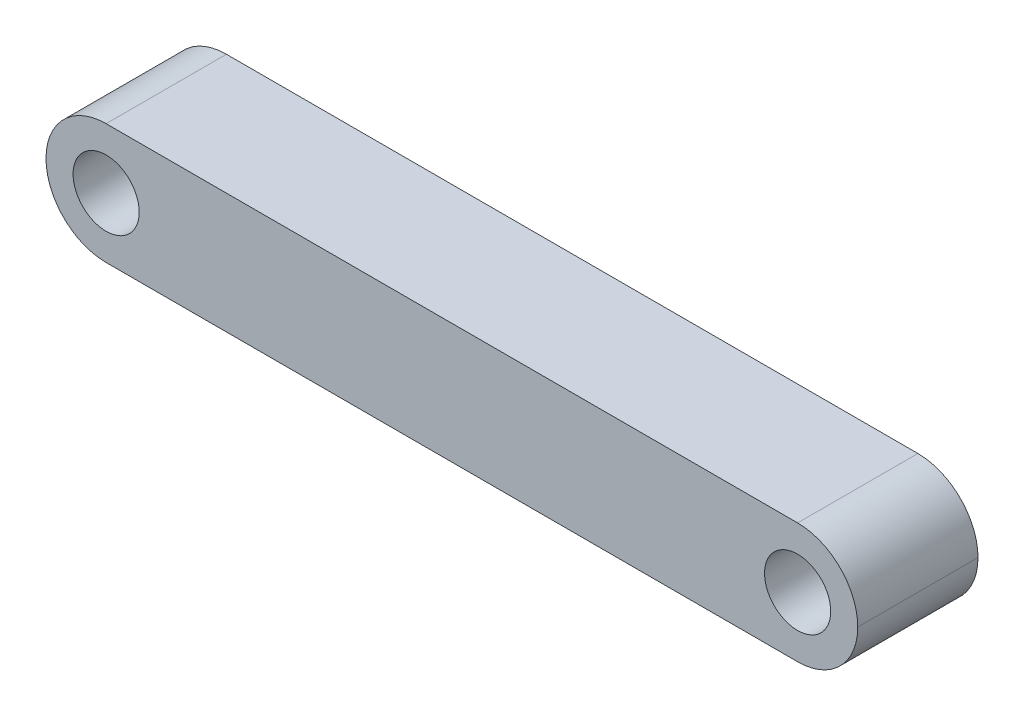
ISO-10303-21;
HEADER;
FILE_DESCRIPTION(('STEP AP214'),'2;1');
FILE_NAME('part.step','',(''),(''),'','','');
FILE_SCHEMA(('AUTOMOTIVE_DESIGN { 1 0 10303 214 1 1 1 1 }'));
ENDSEC;
DATA;
#1=APPLICATION_CONTEXT('core data for automotive mechanical design processes');
#2=APPLICATION_PROTOCOL_DEFINITION('international standard','automotive_design',2000,#1);
#3=PRODUCT_CONTEXT('',#1,'mechanical');
#4=PRODUCT('Part','Part','',(#3));
#5=PRODUCT_RELATED_PRODUCT_CATEGORY('part','',(#4));
#6=PRODUCT_DEFINITION_FORMATION('','',#4);
#7=PRODUCT_DEFINITION_CONTEXT('part definition',#1,'design');
#8=PRODUCT_DEFINITION('design','',#6,#7);
#9=PRODUCT_DEFINITION_SHAPE('','',#8);
#10=(LENGTH_UNIT() NAMED_UNIT(*) SI_UNIT(.MILLI.,.METRE.));
#11=(NAMED_UNIT(*) PLANE_ANGLE_UNIT() SI_UNIT($,.RADIAN.));
#12=(NAMED_UNIT(*) SI_UNIT($,.STERADIAN.) SOLID_ANGLE_UNIT());
#13=UNCERTAINTY_MEASURE_WITH_UNIT(LENGTH_MEASURE(1.E-05),#10,'distance_accuracy_value','');
#14=(GEOMETRIC_REPRESENTATION_CONTEXT(3) GLOBAL_UNCERTAINTY_ASSIGNED_CONTEXT((#13)) GLOBAL_UNIT_ASSIGNED_CONTEXT((#10,
#11,#12)) REPRESENTATION_CONTEXT('',''));
#15=CARTESIAN_POINT('',(0.,0.,0.));
#16=DIRECTION('',(0.,0.,1.));
#17=DIRECTION('',(1.,0.,0.));
#18=AXIS2_PLACEMENT_3D('',#15,#16,#17);
#19=CARTESIAN_POINT('',(-13.5,2.,4.));
#20=DIRECTION('',(0.,-1.,0.));
#21=DIRECTION('',(0.,0.,-1.));
#22=AXIS2_PLACEMENT_3D('',#19,#20,#21);
#23=PLANE('',#22);
#24=DIRECTION('',(-1.,0.,0.));
#25=VECTOR('',#24,1.);
#26=CARTESIAN_POINT('',(-13.5,2.,0.));
#27=LINE('',#26,#25);
#28=CARTESIAN_POINT('',(11.5,2.,0.));
#29=VERTEX_POINT('',#28);
#30=CARTESIAN_POINT('',(-11.5,2.,0.));
#31=VERTEX_POINT('',#30);
#32=EDGE_CURVE('E118',#29,#31,#27,.T.);
#33=ORIENTED_EDGE('',*,*,#32,.T.);
#34=DIRECTION('',(0.,0.,-1.));
#35=VECTOR('',#34,1.);
#36=CARTESIAN_POINT('',(-11.5,2.,4.));
#37=LINE('',#36,#35);
#38=CARTESIAN_POINT('',(-11.5,2.,4.));
#39=VERTEX_POINT('',#38);
#40=EDGE_CURVE('E11',#31,#39,#37,.F.);
#41=ORIENTED_EDGE('',*,*,#40,.T.);
#42=DIRECTION('',(-1.,0.,0.));
#43=VECTOR('',#42,1.);
#44=CARTESIAN_POINT('',(-13.5,2.,4.));
#45=LINE('',#44,#43);
#46=CARTESIAN_POINT('',(11.5,2.,4.));
#47=VERTEX_POINT('',#46);
#48=EDGE_CURVE('E117',#47,#39,#45,.T.);
#49=ORIENTED_EDGE('',*,*,#48,.F.);
#50=DIRECTION('',(0.,0.,-1.));
#51=VECTOR('',#50,1.);
#52=CARTESIAN_POINT('',(11.5,2.,4.));
#53=LINE('',#52,#51);
#54=EDGE_CURVE('E44',#47,#29,#53,.T.);
#55=ORIENTED_EDGE('',*,*,#54,.T.);
#56=EDGE_LOOP('',(#33,#41,#49,#55));
#57=FACE_BOUND('',#56,.T.);
#58=ADVANCED_FACE('F35',(#57),#23,.F.);
#59=CARTESIAN_POINT('',(-13.5,-2.,4.));
#60=DIRECTION('',(0.,1.,0.));
#61=DIRECTION('',(0.,0.,1.));
#62=AXIS2_PLACEMENT_3D('',#59,#60,#61);
#63=PLANE('',#62);
#64=DIRECTION('',(1.,0.,0.));
#65=VECTOR('',#64,1.);
#66=CARTESIAN_POINT('',(-13.5,-2.,4.));
#67=LINE('',#66,#65);
#68=CARTESIAN_POINT('',(-11.5,-2.,4.));
#69=VERTEX_POINT('',#68);
#70=CARTESIAN_POINT('',(11.5,-2.,4.));
#71=VERTEX_POINT('',#70);
#72=EDGE_CURVE('E110',#69,#71,#67,.T.);
#73=ORIENTED_EDGE('',*,*,#72,.F.);
#74=DIRECTION('',(0.,0.,-1.));
#75=VECTOR('',#74,1.);
#76=CARTESIAN_POINT('',(-11.5,-2.,4.));
#77=LINE('',#76,#75);
#78=CARTESIAN_POINT('',(-11.5,-2.,0.));
#79=VERTEX_POINT('',#78);
#80=EDGE_CURVE('E94',#69,#79,#77,.T.);
#81=ORIENTED_EDGE('',*,*,#80,.T.);
#82=DIRECTION('',(1.,0.,0.));
#83=VECTOR('',#82,1.);
#84=CARTESIAN_POINT('',(-13.5,-2.,0.));
#85=LINE('',#84,#83);
#86=CARTESIAN_POINT('',(11.5,-2.,0.));
#87=VERTEX_POINT('',#86);
#88=EDGE_CURVE('E107',#79,#87,#85,.T.);
#89=ORIENTED_EDGE('',*,*,#88,.T.);
#90=DIRECTION('',(0.,0.,-1.));
#91=VECTOR('',#90,1.);
#92=CARTESIAN_POINT('',(11.5,-2.,4.));
#93=LINE('',#92,#91);
#94=EDGE_CURVE('E112',#87,#71,#93,.F.);
#95=ORIENTED_EDGE('',*,*,#94,.T.);
#96=EDGE_LOOP('',(#73,#81,#89,#95));
#97=FACE_BOUND('',#96,.T.);
#98=ADVANCED_FACE('F105',(#97),#63,.F.);
#99=CARTESIAN_POINT('',(0.,0.,4.));
#100=DIRECTION('',(0.,0.,-1.));
#101=DIRECTION('',(-1.,0.,0.));
#102=AXIS2_PLACEMENT_3D('',#99,#100,#101);
#103=PLANE('',#102);
#104=CARTESIAN_POINT('',(-11.5,0.,4.));
#105=DIRECTION('',(0.,0.,1.));
#106=DIRECTION('',(1.,0.,0.));
#107=AXIS2_PLACEMENT_3D('',#104,#105,#106);
#108=CIRCLE('',#107,1.1);
#109=CARTESIAN_POINT('',(-10.4,0.,4.));
#110=VERTEX_POINT('',#109);
#111=EDGE_CURVE('E140',#110,#110,#108,.T.);
#112=ORIENTED_EDGE('',*,*,#111,.F.);
#113=EDGE_LOOP('',(#112));
#114=FACE_BOUND('',#113,.T.);
#115=CARTESIAN_POINT('',(11.5,0.,4.));
#116=DIRECTION('',(0.,0.,1.));
#117=DIRECTION('',(1.,0.,0.));
#118=AXIS2_PLACEMENT_3D('',#115,#116,#117);
#119=CIRCLE('',#118,1.1);
#120=CARTESIAN_POINT('',(12.6,0.,4.));
#121=VERTEX_POINT('',#120);
#122=EDGE_CURVE('E145',#121,#121,#119,.T.);
#123=ORIENTED_EDGE('',*,*,#122,.F.);
#124=EDGE_LOOP('',(#123));
#125=FACE_BOUND('',#124,.T.);
#126=CARTESIAN_POINT('',(-11.5,0.,4.));
#127=DIRECTION('',(0.,0.,-1.));
#128=DIRECTION('',(-1.,0.,0.));
#129=AXIS2_PLACEMENT_3D('',#126,#127,#128);
#130=CIRCLE('',#129,2.);
#131=CARTESIAN_POINT('',(-13.5,0.,4.));
#132=VERTEX_POINT('',#131);
#133=EDGE_CURVE('E52',#39,#132,#130,.F.);
#134=ORIENTED_EDGE('',*,*,#133,.T.);
#135=CARTESIAN_POINT('',(-11.5,0.,4.));
#136=DIRECTION('',(0.,0.,-1.));
#137=DIRECTION('',(-1.,0.,0.));
#138=AXIS2_PLACEMENT_3D('',#135,#136,#137);
#139=CIRCLE('',#138,2.);
#140=EDGE_CURVE('E132',#132,#69,#139,.F.);
#141=ORIENTED_EDGE('',*,*,#140,.T.);
#142=ORIENTED_EDGE('',*,*,#72,.T.);
#143=CARTESIAN_POINT('',(11.5,0.,4.));
#144=DIRECTION('',(0.,0.,-1.));
#145=DIRECTION('',(-1.,0.,0.));
#146=AXIS2_PLACEMENT_3D('',#143,#144,#145);
#147=CIRCLE('',#146,2.);
#148=CARTESIAN_POINT('',(13.5,0.,4.));
#149=VERTEX_POINT('',#148);
#150=EDGE_CURVE('E129',#71,#149,#147,.F.);
#151=ORIENTED_EDGE('',*,*,#150,.T.);
#152=CARTESIAN_POINT('',(11.5,0.,4.));
#153=DIRECTION('',(0.,0.,-1.));
#154=DIRECTION('',(-1.,0.,0.));
#155=AXIS2_PLACEMENT_3D('',#152,#153,#154);
#156=CIRCLE('',#155,2.);
#157=EDGE_CURVE('E99',#149,#47,#156,.F.);
#158=ORIENTED_EDGE('',*,*,#157,.T.);
#159=ORIENTED_EDGE('',*,*,#48,.T.);
#160=EDGE_LOOP('',(#134,#141,#142,#151,#158,#159));
#161=FACE_BOUND('',#160,.T.);
#162=ADVANCED_FACE('F151',(#114,#125,#161),#103,.F.);
#163=CARTESIAN_POINT('',(0.,0.,0.));
#164=DIRECTION('',(0.,0.,-1.));
#165=DIRECTION('',(-1.,0.,0.));
#166=AXIS2_PLACEMENT_3D('',#163,#164,#165);
#167=PLANE('',#166);
#168=CARTESIAN_POINT('',(-11.5,0.,0.));
#169=DIRECTION('',(0.,0.,-1.));
#170=DIRECTION('',(-1.,0.,0.));
#171=AXIS2_PLACEMENT_3D('',#168,#169,#170);
#172=CIRCLE('',#171,1.1);
#173=CARTESIAN_POINT('',(-12.6,0.,0.));
#174=VERTEX_POINT('',#173);
#175=EDGE_CURVE('E39',#174,#174,#172,.T.);
#176=ORIENTED_EDGE('',*,*,#175,.F.);
#177=EDGE_LOOP('',(#176));
#178=FACE_BOUND('',#177,.T.);
#179=CARTESIAN_POINT('',(11.5,0.,0.));
#180=DIRECTION('',(0.,0.,-1.));
#181=DIRECTION('',(-1.,0.,0.));
#182=AXIS2_PLACEMENT_3D('',#179,#180,#181);
#183=CIRCLE('',#182,1.1);
#184=CARTESIAN_POINT('',(10.4,0.,0.));
#185=VERTEX_POINT('',#184);
#186=EDGE_CURVE('E138',#185,#185,#183,.T.);
#187=ORIENTED_EDGE('',*,*,#186,.F.);
#188=EDGE_LOOP('',(#187));
#189=FACE_BOUND('',#188,.T.);
#190=ORIENTED_EDGE('',*,*,#88,.F.);
#191=CARTESIAN_POINT('',(-11.5,0.,0.));
#192=DIRECTION('',(0.,0.,-1.));
#193=DIRECTION('',(-1.,0.,0.));
#194=AXIS2_PLACEMENT_3D('',#191,#192,#193);
#195=CIRCLE('',#194,2.);
#196=CARTESIAN_POINT('',(-13.5,0.,0.));
#197=VERTEX_POINT('',#196);
#198=EDGE_CURVE('E90',#79,#197,#195,.T.);
#199=ORIENTED_EDGE('',*,*,#198,.T.);
#200=CARTESIAN_POINT('',(-11.5,0.,0.));
#201=DIRECTION('',(0.,0.,-1.));
#202=DIRECTION('',(-1.,0.,0.));
#203=AXIS2_PLACEMENT_3D('',#200,#201,#202);
#204=CIRCLE('',#203,2.);
#205=EDGE_CURVE('E100',#197,#31,#204,.T.);
#206=ORIENTED_EDGE('',*,*,#205,.T.);
#207=ORIENTED_EDGE('',*,*,#32,.F.);
#208=CARTESIAN_POINT('',(11.5,0.,0.));
#209=DIRECTION('',(0.,0.,-1.));
#210=DIRECTION('',(-1.,0.,0.));
#211=AXIS2_PLACEMENT_3D('',#208,#209,#210);
#212=CIRCLE('',#211,2.);
#213=CARTESIAN_POINT('',(13.5,0.,0.));
#214=VERTEX_POINT('',#213);
#215=EDGE_CURVE('E111',#29,#214,#212,.T.);
#216=ORIENTED_EDGE('',*,*,#215,.T.);
#217=CARTESIAN_POINT('',(11.5,0.,0.));
#218=DIRECTION('',(0.,0.,-1.));
#219=DIRECTION('',(-1.,0.,0.));
#220=AXIS2_PLACEMENT_3D('',#217,#218,#219);
#221=CIRCLE('',#220,2.);
#222=EDGE_CURVE('E116',#214,#87,#221,.T.);
#223=ORIENTED_EDGE('',*,*,#222,.T.);
#224=EDGE_LOOP('',(#190,#199,#206,#207,#216,#223));
#225=FACE_BOUND('',#224,.T.);
#226=ADVANCED_FACE('F114',(#178,#189,#225),#167,.T.);
#227=CARTESIAN_POINT('',(-11.5,0.,4.));
#228=DIRECTION('',(0.,0.,-1.));
#229=DIRECTION('',(-1.,0.,0.));
#230=AXIS2_PLACEMENT_3D('',#227,#228,#229);
#231=CYLINDRICAL_SURFACE('',#230,2.);
#232=DIRECTION('',(0.,0.,-1.));
#233=VECTOR('',#232,1.);
#234=CARTESIAN_POINT('',(-13.5,0.,4.));
#235=LINE('',#234,#233);
#236=EDGE_CURVE('E95',#132,#197,#235,.T.);
#237=ORIENTED_EDGE('',*,*,#236,.F.);
#238=ORIENTED_EDGE('',*,*,#133,.F.);
#239=ORIENTED_EDGE('',*,*,#40,.F.);
#240=ORIENTED_EDGE('',*,*,#205,.F.);
#241=EDGE_LOOP('',(#237,#238,#239,#240));
#242=FACE_BOUND('',#241,.T.);
#243=ADVANCED_FACE('F177',(#242),#231,.T.);
#244=CARTESIAN_POINT('',(-11.5,0.,4.));
#245=DIRECTION('',(0.,0.,-1.));
#246=DIRECTION('',(-1.,0.,0.));
#247=AXIS2_PLACEMENT_3D('',#244,#245,#246);
#248=CYLINDRICAL_SURFACE('',#247,2.);
#249=ORIENTED_EDGE('',*,*,#140,.F.);
#250=ORIENTED_EDGE('',*,*,#236,.T.);
#251=ORIENTED_EDGE('',*,*,#198,.F.);
#252=ORIENTED_EDGE('',*,*,#80,.F.);
#253=EDGE_LOOP('',(#249,#250,#251,#252));
#254=FACE_BOUND('',#253,.T.);
#255=ADVANCED_FACE('F93',(#254),#248,.T.);
#256=CARTESIAN_POINT('',(11.5,0.,4.));
#257=DIRECTION('',(0.,0.,-1.));
#258=DIRECTION('',(-1.,0.,0.));
#259=AXIS2_PLACEMENT_3D('',#256,#257,#258);
#260=CYLINDRICAL_SURFACE('',#259,2.);
#261=ORIENTED_EDGE('',*,*,#54,.F.);
#262=ORIENTED_EDGE('',*,*,#157,.F.);
#263=DIRECTION('',(0.,0.,-1.));
#264=VECTOR('',#263,1.);
#265=CARTESIAN_POINT('',(13.5,0.,4.));
#266=LINE('',#265,#264);
#267=EDGE_CURVE('E136',#214,#149,#266,.F.);
#268=ORIENTED_EDGE('',*,*,#267,.F.);
#269=ORIENTED_EDGE('',*,*,#215,.F.);
#270=EDGE_LOOP('',(#261,#262,#268,#269));
#271=FACE_BOUND('',#270,.T.);
#272=ADVANCED_FACE('F37',(#271),#260,.T.);
#273=CARTESIAN_POINT('',(11.5,0.,4.));
#274=DIRECTION('',(0.,0.,-1.));
#275=DIRECTION('',(-1.,0.,0.));
#276=AXIS2_PLACEMENT_3D('',#273,#274,#275);
#277=CYLINDRICAL_SURFACE('',#276,2.);
#278=ORIENTED_EDGE('',*,*,#150,.F.);
#279=ORIENTED_EDGE('',*,*,#94,.F.);
#280=ORIENTED_EDGE('',*,*,#222,.F.);
#281=ORIENTED_EDGE('',*,*,#267,.T.);
#282=EDGE_LOOP('',(#278,#279,#280,#281));
#283=FACE_BOUND('',#282,.T.);
#284=ADVANCED_FACE('F158',(#283),#277,.T.);
#285=CARTESIAN_POINT('',(11.5,0.,-9.));
#286=DIRECTION('',(0.,0.,1.));
#287=DIRECTION('',(1.,0.,0.));
#288=AXIS2_PLACEMENT_3D('',#285,#286,#287);
#289=CYLINDRICAL_SURFACE('',#288,1.1);
#290=ORIENTED_EDGE('',*,*,#186,.T.);
#291=EDGE_LOOP('',(#290));
#292=FACE_BOUND('',#291,.T.);
#293=ORIENTED_EDGE('',*,*,#122,.T.);
#294=EDGE_LOOP('',(#293));
#295=FACE_BOUND('',#294,.T.);
#296=ADVANCED_FACE('F160',(#292,#295),#289,.F.);
#297=CARTESIAN_POINT('',(-11.5,0.,-9.));
#298=DIRECTION('',(0.,0.,1.));
#299=DIRECTION('',(1.,0.,0.));
#300=AXIS2_PLACEMENT_3D('',#297,#298,#299);
#301=CYLINDRICAL_SURFACE('',#300,1.1);
#302=ORIENTED_EDGE('',*,*,#175,.T.);
#303=EDGE_LOOP('',(#302));
#304=FACE_BOUND('',#303,.T.);
#305=ORIENTED_EDGE('',*,*,#111,.T.);
#306=EDGE_LOOP('',(#305));
#307=FACE_BOUND('',#306,.T.);
#308=ADVANCED_FACE('F165',(#304,#307),#301,.F.);
#309=CLOSED_SHELL('',(#58,#98,#162,#226,#243,#255,#272,#284,#296,#308));
#310=MANIFOLD_SOLID_BREP('B2',#309);
#311=ADVANCED_BREP_SHAPE_REPRESENTATION('',(#18,#310),#14);
#312=SHAPE_DEFINITION_REPRESENTATION(#9,#311);
ENDSEC;
END-ISO-10303-21;
